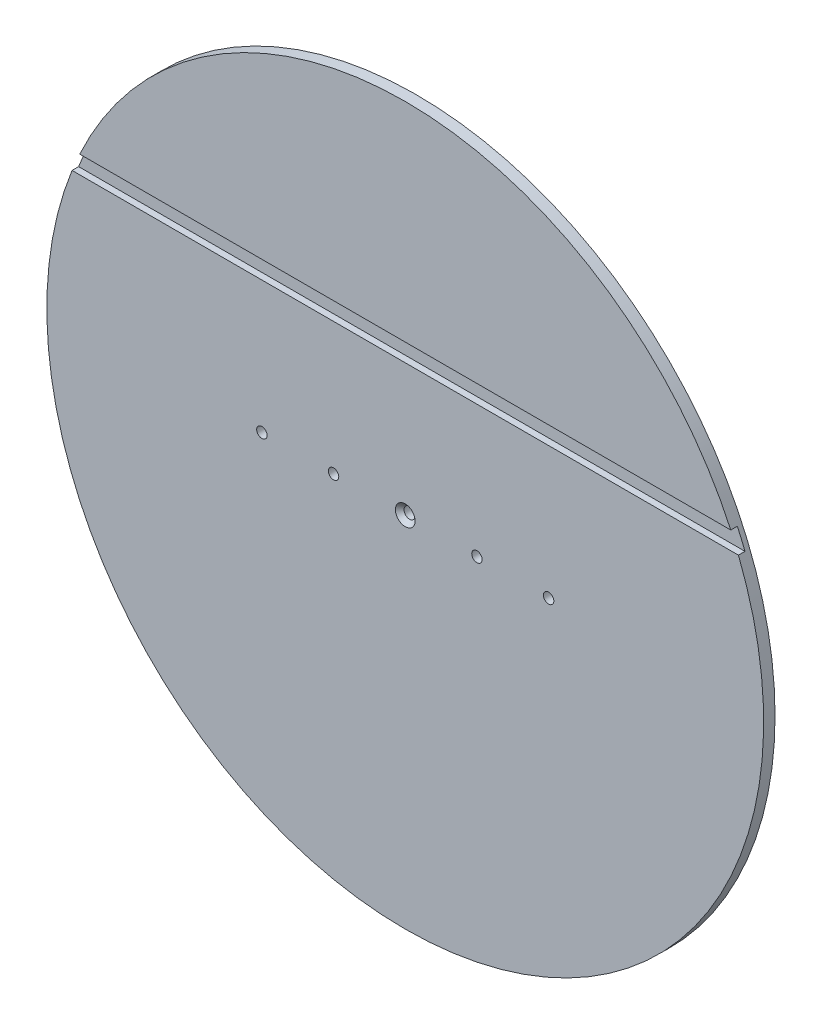
ISO-10303-21;
HEADER;
FILE_DESCRIPTION(('STEP AP214'),'2;1');
FILE_NAME('part.step','',(''),(''),'','','');
FILE_SCHEMA(('AUTOMOTIVE_DESIGN { 1 0 10303 214 1 1 1 1 }'));
ENDSEC;
DATA;
#1=APPLICATION_CONTEXT('core data for automotive mechanical design processes');
#2=APPLICATION_PROTOCOL_DEFINITION('international standard','automotive_design',2000,#1);
#3=PRODUCT_CONTEXT('',#1,'mechanical');
#4=PRODUCT('Part','Part','',(#3));
#5=PRODUCT_RELATED_PRODUCT_CATEGORY('part','',(#4));
#6=PRODUCT_DEFINITION_FORMATION('','',#4);
#7=PRODUCT_DEFINITION_CONTEXT('part definition',#1,'design');
#8=PRODUCT_DEFINITION('design','',#6,#7);
#9=PRODUCT_DEFINITION_SHAPE('','',#8);
#10=(LENGTH_UNIT() NAMED_UNIT(*) SI_UNIT(.MILLI.,.METRE.));
#11=(NAMED_UNIT(*) PLANE_ANGLE_UNIT() SI_UNIT($,.RADIAN.));
#12=(NAMED_UNIT(*) SI_UNIT($,.STERADIAN.) SOLID_ANGLE_UNIT());
#13=UNCERTAINTY_MEASURE_WITH_UNIT(LENGTH_MEASURE(1.E-05),#10,'distance_accuracy_value','');
#14=(GEOMETRIC_REPRESENTATION_CONTEXT(3) GLOBAL_UNCERTAINTY_ASSIGNED_CONTEXT((#13)) GLOBAL_UNIT_ASSIGNED_CONTEXT((#10,
#11,#12)) REPRESENTATION_CONTEXT('',''));
#15=CARTESIAN_POINT('',(0.,0.,0.));
#16=DIRECTION('',(0.,0.,1.));
#17=DIRECTION('',(1.,0.,0.));
#18=AXIS2_PLACEMENT_3D('',#15,#16,#17);
#19=CARTESIAN_POINT('',(0.,0.,3.175));
#20=DIRECTION('',(0.,0.,-1.));
#21=DIRECTION('',(-1.,0.,0.));
#22=AXIS2_PLACEMENT_3D('',#19,#20,#21);
#23=CYLINDRICAL_SURFACE('',#22,100.);
#24=CARTESIAN_POINT('',(0.,0.,0.));
#25=DIRECTION('',(0.,0.,1.));
#26=DIRECTION('',(1.,0.,0.));
#27=AXIS2_PLACEMENT_3D('',#24,#25,#26);
#28=CIRCLE('',#27,100.);
#29=CARTESIAN_POINT('',(100.,0.,0.));
#30=VERTEX_POINT('',#29);
#31=EDGE_CURVE('E134',#30,#30,#28,.T.);
#32=ORIENTED_EDGE('',*,*,#31,.T.);
#33=EDGE_LOOP('',(#32));
#34=FACE_BOUND('',#33,.T.);
#35=DIRECTION('',(0.,0.,1.));
#36=VECTOR('',#35,1.);
#37=CARTESIAN_POINT('',(92.9627748079853,36.8499999999976,3.175));
#38=LINE('',#37,#36);
#39=CARTESIAN_POINT('',(92.9627748079853,36.8499999999976,3.175));
#40=VERTEX_POINT('',#39);
#41=CARTESIAN_POINT('',(92.9627748079853,36.8499999999976,1.345));
#42=VERTEX_POINT('',#41);
#43=EDGE_CURVE('E78',#40,#42,#38,.F.);
#44=ORIENTED_EDGE('',*,*,#43,.F.);
#45=CARTESIAN_POINT('',(0.,0.,3.175));
#46=DIRECTION('',(0.,0.,1.));
#47=DIRECTION('',(1.,0.,0.));
#48=AXIS2_PLACEMENT_3D('',#45,#46,#47);
#49=CIRCLE('',#48,100.);
#50=CARTESIAN_POINT('',(-92.9627748079853,36.8499999999976,3.175));
#51=VERTEX_POINT('',#50);
#52=EDGE_CURVE('E131',#51,#40,#49,.T.);
#53=ORIENTED_EDGE('',*,*,#52,.F.);
#54=DIRECTION('',(0.,0.,1.));
#55=VECTOR('',#54,1.);
#56=CARTESIAN_POINT('',(-92.9627748079853,36.8499999999976,3.175));
#57=LINE('',#56,#55);
#58=CARTESIAN_POINT('',(-92.9627748079853,36.8499999999976,1.345));
#59=VERTEX_POINT('',#58);
#60=EDGE_CURVE('E87',#59,#51,#57,.T.);
#61=ORIENTED_EDGE('',*,*,#60,.F.);
#62=CARTESIAN_POINT('',(0.,0.,1.345));
#63=DIRECTION('',(0.,0.,1.));
#64=DIRECTION('',(0.,-1.,0.));
#65=AXIS2_PLACEMENT_3D('',#62,#63,#64);
#66=CIRCLE('',#65,100.);
#67=CARTESIAN_POINT('',(-90.8216796805708,41.8499999999976,1.34499999999999));
#68=VERTEX_POINT('',#67);
#69=EDGE_CURVE('E95',#68,#59,#66,.T.);
#70=ORIENTED_EDGE('',*,*,#69,.F.);
#71=DIRECTION('',(0.,0.,1.));
#72=VECTOR('',#71,1.);
#73=CARTESIAN_POINT('',(-90.8216796805708,41.8499999999976,3.17499999999999));
#74=LINE('',#73,#72);
#75=CARTESIAN_POINT('',(-90.8216796805708,41.8499999999976,3.175));
#76=VERTEX_POINT('',#75);
#77=EDGE_CURVE('E105',#76,#68,#74,.F.);
#78=ORIENTED_EDGE('',*,*,#77,.F.);
#79=CARTESIAN_POINT('',(90.8216796805708,41.8499999999976,3.175));
#80=VERTEX_POINT('',#79);
#81=EDGE_CURVE('E133',#80,#76,#49,.T.);
#82=ORIENTED_EDGE('',*,*,#81,.F.);
#83=DIRECTION('',(0.,0.,1.));
#84=VECTOR('',#83,1.);
#85=CARTESIAN_POINT('',(90.8216796805708,41.8499999999976,3.17499999999999));
#86=LINE('',#85,#84);
#87=CARTESIAN_POINT('',(90.8216796805708,41.8499999999976,1.34499999999999));
#88=VERTEX_POINT('',#87);
#89=EDGE_CURVE('E57',#88,#80,#86,.T.);
#90=ORIENTED_EDGE('',*,*,#89,.F.);
#91=EDGE_CURVE('E88',#42,#88,#66,.T.);
#92=ORIENTED_EDGE('',*,*,#91,.F.);
#93=EDGE_LOOP('',(#44,#53,#61,#70,#78,#82,#90,#92));
#94=FACE_BOUND('',#93,.T.);
#95=ADVANCED_FACE('F43',(#34,#94),#23,.T.);
#96=CARTESIAN_POINT('',(0.,0.,3.175));
#97=DIRECTION('',(0.,0.,1.));
#98=DIRECTION('',(1.,0.,0.));
#99=AXIS2_PLACEMENT_3D('',#96,#97,#98);
#100=PLANE('',#99);
#101=CARTESIAN_POINT('',(40.,0.,3.175));
#102=DIRECTION('',(0.,0.,1.));
#103=DIRECTION('',(1.,0.,0.));
#104=AXIS2_PLACEMENT_3D('',#101,#102,#103);
#105=CIRCLE('',#104,1.45);
#106=CARTESIAN_POINT('',(41.45,0.,3.175));
#107=VERTEX_POINT('',#106);
#108=EDGE_CURVE('E106',#107,#107,#105,.T.);
#109=ORIENTED_EDGE('',*,*,#108,.F.);
#110=EDGE_LOOP('',(#109));
#111=FACE_BOUND('',#110,.T.);
#112=CARTESIAN_POINT('',(20.,0.,3.175));
#113=DIRECTION('',(0.,0.,1.));
#114=DIRECTION('',(1.,0.,0.));
#115=AXIS2_PLACEMENT_3D('',#112,#113,#114);
#116=CIRCLE('',#115,1.45);
#117=CARTESIAN_POINT('',(21.45,0.,3.175));
#118=VERTEX_POINT('',#117);
#119=EDGE_CURVE('E112',#118,#118,#116,.T.);
#120=ORIENTED_EDGE('',*,*,#119,.F.);
#121=EDGE_LOOP('',(#120));
#122=FACE_BOUND('',#121,.T.);
#123=CARTESIAN_POINT('',(-40.,0.,3.175));
#124=DIRECTION('',(0.,0.,1.));
#125=DIRECTION('',(1.,0.,0.));
#126=AXIS2_PLACEMENT_3D('',#123,#124,#125);
#127=CIRCLE('',#126,1.45);
#128=CARTESIAN_POINT('',(-38.55,0.,3.175));
#129=VERTEX_POINT('',#128);
#130=EDGE_CURVE('E116',#129,#129,#127,.T.);
#131=ORIENTED_EDGE('',*,*,#130,.F.);
#132=EDGE_LOOP('',(#131));
#133=FACE_BOUND('',#132,.T.);
#134=CARTESIAN_POINT('',(-20.,0.,3.175));
#135=DIRECTION('',(0.,0.,1.));
#136=DIRECTION('',(1.,0.,0.));
#137=AXIS2_PLACEMENT_3D('',#134,#135,#136);
#138=CIRCLE('',#137,1.45);
#139=CARTESIAN_POINT('',(-18.55,0.,3.175));
#140=VERTEX_POINT('',#139);
#141=EDGE_CURVE('E120',#140,#140,#138,.T.);
#142=ORIENTED_EDGE('',*,*,#141,.F.);
#143=EDGE_LOOP('',(#142));
#144=FACE_BOUND('',#143,.T.);
#145=CARTESIAN_POINT('',(0.,0.,3.175));
#146=DIRECTION('',(0.,0.,1.));
#147=DIRECTION('',(1.,0.,0.));
#148=AXIS2_PLACEMENT_3D('',#145,#146,#147);
#149=CIRCLE('',#148,2.75);
#150=CARTESIAN_POINT('',(2.75,0.,3.175));
#151=VERTEX_POINT('',#150);
#152=EDGE_CURVE('E124',#151,#151,#149,.T.);
#153=ORIENTED_EDGE('',*,*,#152,.F.);
#154=EDGE_LOOP('',(#153));
#155=FACE_BOUND('',#154,.T.);
#156=ORIENTED_EDGE('',*,*,#52,.T.);
#157=DIRECTION('',(-1.,0.,0.));
#158=VECTOR('',#157,1.);
#159=CARTESIAN_POINT('',(0.,36.8499999999976,3.175));
#160=LINE('',#159,#158);
#161=EDGE_CURVE('E11',#40,#51,#160,.T.);
#162=ORIENTED_EDGE('',*,*,#161,.T.);
#163=EDGE_LOOP('',(#156,#162));
#164=FACE_BOUND('',#163,.T.);
#165=ADVANCED_FACE('F164',(#111,#122,#133,#144,#155,#164),#100,.T.);
#166=ORIENTED_EDGE('',*,*,#81,.T.);
#167=DIRECTION('',(1.,0.,0.));
#168=VECTOR('',#167,1.);
#169=CARTESIAN_POINT('',(0.,41.8499999999976,3.175));
#170=LINE('',#169,#168);
#171=EDGE_CURVE('E50',#76,#80,#170,.T.);
#172=ORIENTED_EDGE('',*,*,#171,.T.);
#173=EDGE_LOOP('',(#166,#172));
#174=FACE_BOUND('',#173,.T.);
#175=ADVANCED_FACE('F146',(#174),#100,.T.);
#176=CARTESIAN_POINT('',(0.,0.,0.));
#177=DIRECTION('',(0.,0.,1.));
#178=DIRECTION('',(1.,0.,0.));
#179=AXIS2_PLACEMENT_3D('',#176,#177,#178);
#180=PLANE('',#179);
#181=CARTESIAN_POINT('',(40.,0.,0.));
#182=DIRECTION('',(0.,0.,1.));
#183=DIRECTION('',(1.,0.,0.));
#184=AXIS2_PLACEMENT_3D('',#181,#182,#183);
#185=CIRCLE('',#184,1.45);
#186=CARTESIAN_POINT('',(41.45,0.,0.));
#187=VERTEX_POINT('',#186);
#188=EDGE_CURVE('E109',#187,#187,#185,.T.);
#189=ORIENTED_EDGE('',*,*,#188,.T.);
#190=EDGE_LOOP('',(#189));
#191=FACE_BOUND('',#190,.T.);
#192=CARTESIAN_POINT('',(20.,0.,0.));
#193=DIRECTION('',(0.,0.,1.));
#194=DIRECTION('',(1.,0.,0.));
#195=AXIS2_PLACEMENT_3D('',#192,#193,#194);
#196=CIRCLE('',#195,1.45);
#197=CARTESIAN_POINT('',(21.45,0.,0.));
#198=VERTEX_POINT('',#197);
#199=EDGE_CURVE('E115',#198,#198,#196,.T.);
#200=ORIENTED_EDGE('',*,*,#199,.T.);
#201=EDGE_LOOP('',(#200));
#202=FACE_BOUND('',#201,.T.);
#203=CARTESIAN_POINT('',(-40.,0.,0.));
#204=DIRECTION('',(0.,0.,1.));
#205=DIRECTION('',(1.,0.,0.));
#206=AXIS2_PLACEMENT_3D('',#203,#204,#205);
#207=CIRCLE('',#206,1.45);
#208=CARTESIAN_POINT('',(-38.55,0.,0.));
#209=VERTEX_POINT('',#208);
#210=EDGE_CURVE('E119',#209,#209,#207,.T.);
#211=ORIENTED_EDGE('',*,*,#210,.T.);
#212=EDGE_LOOP('',(#211));
#213=FACE_BOUND('',#212,.T.);
#214=CARTESIAN_POINT('',(-20.,0.,0.));
#215=DIRECTION('',(0.,0.,1.));
#216=DIRECTION('',(1.,0.,0.));
#217=AXIS2_PLACEMENT_3D('',#214,#215,#216);
#218=CIRCLE('',#217,1.45);
#219=CARTESIAN_POINT('',(-18.55,0.,0.));
#220=VERTEX_POINT('',#219);
#221=EDGE_CURVE('E123',#220,#220,#218,.T.);
#222=ORIENTED_EDGE('',*,*,#221,.T.);
#223=EDGE_LOOP('',(#222));
#224=FACE_BOUND('',#223,.T.);
#225=CARTESIAN_POINT('',(0.,0.,0.));
#226=DIRECTION('',(0.,0.,1.));
#227=DIRECTION('',(1.,0.,0.));
#228=AXIS2_PLACEMENT_3D('',#225,#226,#227);
#229=CIRCLE('',#228,1.55);
#230=CARTESIAN_POINT('',(1.55,0.,0.));
#231=VERTEX_POINT('',#230);
#232=EDGE_CURVE('E130',#231,#231,#229,.T.);
#233=ORIENTED_EDGE('',*,*,#232,.T.);
#234=EDGE_LOOP('',(#233));
#235=FACE_BOUND('',#234,.T.);
#236=ORIENTED_EDGE('',*,*,#31,.F.);
#237=EDGE_LOOP('',(#236));
#238=FACE_BOUND('',#237,.T.);
#239=ADVANCED_FACE('F174',(#191,#202,#213,#224,#235,#238),#180,.F.);
#240=CARTESIAN_POINT('',(0.,0.,3.175));
#241=DIRECTION('',(0.,0.,1.));
#242=DIRECTION('',(1.,0.,0.));
#243=AXIS2_PLACEMENT_3D('',#240,#241,#242);
#244=CYLINDRICAL_SURFACE('',#243,1.55);
#245=CARTESIAN_POINT('',(0.,0.,1.975));
#246=DIRECTION('',(0.,0.,1.));
#247=DIRECTION('',(1.,0.,0.));
#248=AXIS2_PLACEMENT_3D('',#245,#246,#247);
#249=CIRCLE('',#248,1.55);
#250=CARTESIAN_POINT('',(1.55,0.,1.975));
#251=VERTEX_POINT('',#250);
#252=EDGE_CURVE('E127',#251,#251,#249,.T.);
#253=ORIENTED_EDGE('',*,*,#252,.T.);
#254=EDGE_LOOP('',(#253));
#255=FACE_BOUND('',#254,.T.);
#256=ORIENTED_EDGE('',*,*,#232,.F.);
#257=EDGE_LOOP('',(#256));
#258=FACE_BOUND('',#257,.T.);
#259=ADVANCED_FACE('F176',(#255,#258),#244,.F.);
#260=CARTESIAN_POINT('',(0.,0.,3.175));
#261=DIRECTION('',(0.,0.,1.));
#262=DIRECTION('',(1.,0.,0.));
#263=AXIS2_PLACEMENT_3D('',#260,#261,#262);
#264=CONICAL_SURFACE('',#263,2.75,0.785398163397447);
#265=ORIENTED_EDGE('',*,*,#252,.F.);
#266=EDGE_LOOP('',(#265));
#267=FACE_BOUND('',#266,.T.);
#268=ORIENTED_EDGE('',*,*,#152,.T.);
#269=EDGE_LOOP('',(#268));
#270=FACE_BOUND('',#269,.T.);
#271=ADVANCED_FACE('F183',(#267,#270),#264,.F.);
#272=CARTESIAN_POINT('',(-20.,0.,3.175));
#273=DIRECTION('',(0.,0.,1.));
#274=DIRECTION('',(1.,0.,0.));
#275=AXIS2_PLACEMENT_3D('',#272,#273,#274);
#276=CYLINDRICAL_SURFACE('',#275,1.45);
#277=ORIENTED_EDGE('',*,*,#141,.T.);
#278=EDGE_LOOP('',(#277));
#279=FACE_BOUND('',#278,.T.);
#280=ORIENTED_EDGE('',*,*,#221,.F.);
#281=EDGE_LOOP('',(#280));
#282=FACE_BOUND('',#281,.T.);
#283=ADVANCED_FACE('F190',(#279,#282),#276,.F.);
#284=CARTESIAN_POINT('',(-40.,0.,3.175));
#285=DIRECTION('',(0.,0.,1.));
#286=DIRECTION('',(1.,0.,0.));
#287=AXIS2_PLACEMENT_3D('',#284,#285,#286);
#288=CYLINDRICAL_SURFACE('',#287,1.45);
#289=ORIENTED_EDGE('',*,*,#130,.T.);
#290=EDGE_LOOP('',(#289));
#291=FACE_BOUND('',#290,.T.);
#292=ORIENTED_EDGE('',*,*,#210,.F.);
#293=EDGE_LOOP('',(#292));
#294=FACE_BOUND('',#293,.T.);
#295=ADVANCED_FACE('F194',(#291,#294),#288,.F.);
#296=CARTESIAN_POINT('',(20.,0.,3.175));
#297=DIRECTION('',(0.,0.,1.));
#298=DIRECTION('',(1.,0.,0.));
#299=AXIS2_PLACEMENT_3D('',#296,#297,#298);
#300=CYLINDRICAL_SURFACE('',#299,1.45);
#301=ORIENTED_EDGE('',*,*,#119,.T.);
#302=EDGE_LOOP('',(#301));
#303=FACE_BOUND('',#302,.T.);
#304=ORIENTED_EDGE('',*,*,#199,.F.);
#305=EDGE_LOOP('',(#304));
#306=FACE_BOUND('',#305,.T.);
#307=ADVANCED_FACE('F198',(#303,#306),#300,.F.);
#308=CARTESIAN_POINT('',(40.,0.,3.175));
#309=DIRECTION('',(0.,0.,1.));
#310=DIRECTION('',(1.,0.,0.));
#311=AXIS2_PLACEMENT_3D('',#308,#309,#310);
#312=CYLINDRICAL_SURFACE('',#311,1.45);
#313=ORIENTED_EDGE('',*,*,#108,.T.);
#314=EDGE_LOOP('',(#313));
#315=FACE_BOUND('',#314,.T.);
#316=ORIENTED_EDGE('',*,*,#188,.F.);
#317=EDGE_LOOP('',(#316));
#318=FACE_BOUND('',#317,.T.);
#319=ADVANCED_FACE('F161',(#315,#318),#312,.F.);
#320=CARTESIAN_POINT('',(125.,36.8499999999976,8.645));
#321=DIRECTION('',(0.,1.,0.));
#322=DIRECTION('',(0.,0.,1.));
#323=AXIS2_PLACEMENT_3D('',#320,#321,#322);
#324=PLANE('',#323);
#325=ORIENTED_EDGE('',*,*,#43,.T.);
#326=DIRECTION('',(-1.,0.,0.));
#327=VECTOR('',#326,1.);
#328=CARTESIAN_POINT('',(125.,36.8499999999976,1.345));
#329=LINE('',#328,#327);
#330=EDGE_CURVE('E81',#42,#59,#329,.T.);
#331=ORIENTED_EDGE('',*,*,#330,.T.);
#332=ORIENTED_EDGE('',*,*,#60,.T.);
#333=ORIENTED_EDGE('',*,*,#161,.F.);
#334=EDGE_LOOP('',(#325,#331,#332,#333));
#335=FACE_BOUND('',#334,.T.);
#336=ADVANCED_FACE('F80',(#335),#324,.T.);
#337=CARTESIAN_POINT('',(125.,41.8499999999976,1.345));
#338=DIRECTION('',(0.,-1.,0.));
#339=DIRECTION('',(1.,0.,0.));
#340=AXIS2_PLACEMENT_3D('',#337,#338,#339);
#341=PLANE('',#340);
#342=ORIENTED_EDGE('',*,*,#77,.T.);
#343=DIRECTION('',(-1.,0.,0.));
#344=VECTOR('',#343,1.);
#345=CARTESIAN_POINT('',(125.,41.8499999999976,1.345));
#346=LINE('',#345,#344);
#347=EDGE_CURVE('E98',#88,#68,#346,.T.);
#348=ORIENTED_EDGE('',*,*,#347,.F.);
#349=ORIENTED_EDGE('',*,*,#89,.T.);
#350=ORIENTED_EDGE('',*,*,#171,.F.);
#351=EDGE_LOOP('',(#342,#348,#349,#350));
#352=FACE_BOUND('',#351,.T.);
#353=ADVANCED_FACE('F152',(#352),#341,.T.);
#354=CARTESIAN_POINT('',(125.,36.8499999999976,1.345));
#355=DIRECTION('',(0.,0.,1.));
#356=DIRECTION('',(0.,-1.,0.));
#357=AXIS2_PLACEMENT_3D('',#354,#355,#356);
#358=PLANE('',#357);
#359=ORIENTED_EDGE('',*,*,#91,.T.);
#360=ORIENTED_EDGE('',*,*,#347,.T.);
#361=ORIENTED_EDGE('',*,*,#69,.T.);
#362=ORIENTED_EDGE('',*,*,#330,.F.);
#363=EDGE_LOOP('',(#359,#360,#361,#362));
#364=FACE_BOUND('',#363,.T.);
#365=ADVANCED_FACE('F92',(#364),#358,.T.);
#366=CLOSED_SHELL('',(#95,#165,#175,#239,#259,#271,#283,#295,#307,#319,#336,#353,#365));
#367=MANIFOLD_SOLID_BREP('B2',#366);
#368=ADVANCED_BREP_SHAPE_REPRESENTATION('',(#18,#367),#14);
#369=SHAPE_DEFINITION_REPRESENTATION(#9,#368);
ENDSEC;
END-ISO-10303-21;
